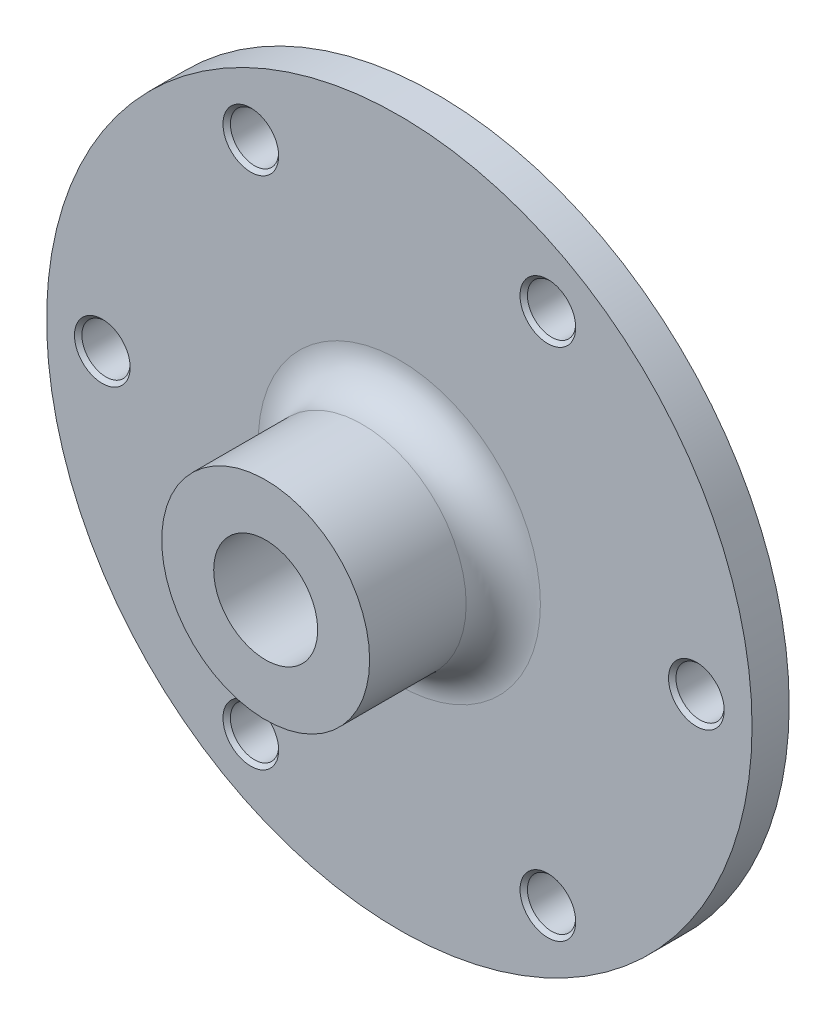
ISO-10303-21;
HEADER;
FILE_DESCRIPTION(('STEP AP214'),'2;1');
FILE_NAME('part.step','',(''),(''),'','','');
FILE_SCHEMA(('AUTOMOTIVE_DESIGN { 1 0 10303 214 1 1 1 1 }'));
ENDSEC;
DATA;
#1=APPLICATION_CONTEXT('core data for automotive mechanical design processes');
#2=APPLICATION_PROTOCOL_DEFINITION('international standard','automotive_design',2000,#1);
#3=PRODUCT_CONTEXT('',#1,'mechanical');
#4=PRODUCT('Part','Part','',(#3));
#5=PRODUCT_RELATED_PRODUCT_CATEGORY('part','',(#4));
#6=PRODUCT_DEFINITION_FORMATION('','',#4);
#7=PRODUCT_DEFINITION_CONTEXT('part definition',#1,'design');
#8=PRODUCT_DEFINITION('design','',#6,#7);
#9=PRODUCT_DEFINITION_SHAPE('','',#8);
#10=(LENGTH_UNIT() NAMED_UNIT(*) SI_UNIT(.MILLI.,.METRE.));
#11=(NAMED_UNIT(*) PLANE_ANGLE_UNIT() SI_UNIT($,.RADIAN.));
#12=(NAMED_UNIT(*) SI_UNIT($,.STERADIAN.) SOLID_ANGLE_UNIT());
#13=UNCERTAINTY_MEASURE_WITH_UNIT(LENGTH_MEASURE(1.E-05),#10,'distance_accuracy_value','');
#14=(GEOMETRIC_REPRESENTATION_CONTEXT(3) GLOBAL_UNCERTAINTY_ASSIGNED_CONTEXT((#13)) GLOBAL_UNIT_ASSIGNED_CONTEXT((#10,
#11,#12)) REPRESENTATION_CONTEXT('',''));
#15=CARTESIAN_POINT('',(0.,0.,0.));
#16=DIRECTION('',(0.,0.,1.));
#17=DIRECTION('',(1.,0.,0.));
#18=AXIS2_PLACEMENT_3D('',#15,#16,#17);
#19=CARTESIAN_POINT('',(0.,0.,2.5));
#20=DIRECTION('',(0.,0.,-1.));
#21=DIRECTION('',(-1.,0.,0.));
#22=AXIS2_PLACEMENT_3D('',#19,#20,#21);
#23=CYLINDRICAL_SURFACE('',#22,47.5);
#24=CARTESIAN_POINT('',(0.,0.,2.5));
#25=DIRECTION('',(0.,0.,1.));
#26=DIRECTION('',(1.,0.,0.));
#27=AXIS2_PLACEMENT_3D('',#24,#25,#26);
#28=CIRCLE('',#27,47.5);
#29=CARTESIAN_POINT('',(47.5,0.,2.5));
#30=VERTEX_POINT('',#29);
#31=EDGE_CURVE('E147',#30,#30,#28,.T.);
#32=ORIENTED_EDGE('',*,*,#31,.F.);
#33=EDGE_LOOP('',(#32));
#34=FACE_BOUND('',#33,.T.);
#35=CARTESIAN_POINT('',(0.,0.,-2.5));
#36=DIRECTION('',(0.,0.,1.));
#37=DIRECTION('',(1.,0.,0.));
#38=AXIS2_PLACEMENT_3D('',#35,#36,#37);
#39=CIRCLE('',#38,47.5);
#40=CARTESIAN_POINT('',(47.5,0.,-2.5));
#41=VERTEX_POINT('',#40);
#42=EDGE_CURVE('E143',#41,#41,#39,.T.);
#43=ORIENTED_EDGE('',*,*,#42,.T.);
#44=EDGE_LOOP('',(#43));
#45=FACE_BOUND('',#44,.T.);
#46=ADVANCED_FACE('F40',(#34,#45),#23,.T.);
#47=CARTESIAN_POINT('',(0.,0.,2.5));
#48=DIRECTION('',(0.,0.,1.));
#49=DIRECTION('',(1.,0.,0.));
#50=AXIS2_PLACEMENT_3D('',#47,#48,#49);
#51=PLANE('',#50);
#52=CARTESIAN_POINT('',(-20.0000000000004,34.6410161513773,2.5));
#53=DIRECTION('',(0.,0.,1.));
#54=DIRECTION('',(1.,0.,0.));
#55=AXIS2_PLACEMENT_3D('',#52,#53,#54);
#56=CIRCLE('',#55,3.75);
#57=CARTESIAN_POINT('',(-16.2500000000004,34.6410161513773,2.5));
#58=VERTEX_POINT('',#57);
#59=EDGE_CURVE('E445',#58,#58,#56,.T.);
#60=ORIENTED_EDGE('',*,*,#59,.F.);
#61=EDGE_LOOP('',(#60));
#62=FACE_BOUND('',#61,.T.);
#63=CARTESIAN_POINT('',(19.9999999999997,34.6410161513777,2.5));
#64=DIRECTION('',(0.,0.,1.));
#65=DIRECTION('',(1.,0.,0.));
#66=AXIS2_PLACEMENT_3D('',#63,#64,#65);
#67=CIRCLE('',#66,3.75);
#68=CARTESIAN_POINT('',(23.7499999999997,34.6410161513777,2.5));
#69=VERTEX_POINT('',#68);
#70=EDGE_CURVE('E94',#69,#69,#67,.T.);
#71=ORIENTED_EDGE('',*,*,#70,.F.);
#72=EDGE_LOOP('',(#71));
#73=FACE_BOUND('',#72,.T.);
#74=CARTESIAN_POINT('',(40.,0.,2.5));
#75=DIRECTION('',(0.,0.,1.));
#76=DIRECTION('',(1.,0.,0.));
#77=AXIS2_PLACEMENT_3D('',#74,#75,#76);
#78=CIRCLE('',#77,3.75);
#79=CARTESIAN_POINT('',(43.75,0.,2.5));
#80=VERTEX_POINT('',#79);
#81=EDGE_CURVE('E85',#80,#80,#78,.T.);
#82=ORIENTED_EDGE('',*,*,#81,.F.);
#83=EDGE_LOOP('',(#82));
#84=FACE_BOUND('',#83,.T.);
#85=CARTESIAN_POINT('',(20.0000000000002,-34.6410161513775,2.5));
#86=DIRECTION('',(0.,0.,1.));
#87=DIRECTION('',(1.,0.,0.));
#88=AXIS2_PLACEMENT_3D('',#85,#86,#87);
#89=CIRCLE('',#88,3.75);
#90=CARTESIAN_POINT('',(23.7500000000002,-34.6410161513775,2.5));
#91=VERTEX_POINT('',#90);
#92=EDGE_CURVE('E80',#91,#91,#89,.T.);
#93=ORIENTED_EDGE('',*,*,#92,.F.);
#94=EDGE_LOOP('',(#93));
#95=FACE_BOUND('',#94,.T.);
#96=CARTESIAN_POINT('',(-19.9999999999999,-34.6410161513776,2.5));
#97=DIRECTION('',(0.,0.,1.));
#98=DIRECTION('',(1.,0.,0.));
#99=AXIS2_PLACEMENT_3D('',#96,#97,#98);
#100=CIRCLE('',#99,3.75);
#101=CARTESIAN_POINT('',(-16.2499999999999,-34.6410161513776,2.5));
#102=VERTEX_POINT('',#101);
#103=EDGE_CURVE('E75',#102,#102,#100,.T.);
#104=ORIENTED_EDGE('',*,*,#103,.F.);
#105=EDGE_LOOP('',(#104));
#106=FACE_BOUND('',#105,.T.);
#107=CARTESIAN_POINT('',(-40.,0.,2.5));
#108=DIRECTION('',(0.,0.,1.));
#109=DIRECTION('',(1.,0.,0.));
#110=AXIS2_PLACEMENT_3D('',#107,#108,#109);
#111=CIRCLE('',#110,3.75);
#112=CARTESIAN_POINT('',(-36.25,0.,2.5));
#113=VERTEX_POINT('',#112);
#114=EDGE_CURVE('E69',#113,#113,#111,.T.);
#115=ORIENTED_EDGE('',*,*,#114,.F.);
#116=EDGE_LOOP('',(#115));
#117=FACE_BOUND('',#116,.T.);
#118=CARTESIAN_POINT('',(0.,0.,2.5));
#119=DIRECTION('',(0.,0.,1.));
#120=DIRECTION('',(1.,0.,0.));
#121=AXIS2_PLACEMENT_3D('',#118,#119,#120);
#122=CIRCLE('',#121,19.);
#123=CARTESIAN_POINT('',(19.,0.,2.5));
#124=VERTEX_POINT('',#123);
#125=EDGE_CURVE('E10',#124,#124,#122,.F.);
#126=ORIENTED_EDGE('',*,*,#125,.T.);
#127=EDGE_LOOP('',(#126));
#128=FACE_BOUND('',#127,.T.);
#129=ORIENTED_EDGE('',*,*,#31,.T.);
#130=EDGE_LOOP('',(#129));
#131=FACE_BOUND('',#130,.T.);
#132=ADVANCED_FACE('F158',(#62,#73,#84,#95,#106,#117,#128,#131),#51,.T.);
#133=CARTESIAN_POINT('',(0.,0.,-2.5));
#134=DIRECTION('',(0.,0.,1.));
#135=DIRECTION('',(1.,0.,0.));
#136=AXIS2_PLACEMENT_3D('',#133,#134,#135);
#137=PLANE('',#136);
#138=CARTESIAN_POINT('',(-20.0000000000004,34.6410161513773,-2.5));
#139=DIRECTION('',(0.,0.,1.));
#140=DIRECTION('',(1.,0.,0.));
#141=AXIS2_PLACEMENT_3D('',#138,#139,#140);
#142=CIRCLE('',#141,3.25);
#143=CARTESIAN_POINT('',(-16.7500000000004,34.6410161513773,-2.5));
#144=VERTEX_POINT('',#143);
#145=EDGE_CURVE('E44',#144,#144,#142,.T.);
#146=ORIENTED_EDGE('',*,*,#145,.T.);
#147=EDGE_LOOP('',(#146));
#148=FACE_BOUND('',#147,.T.);
#149=CARTESIAN_POINT('',(19.9999999999997,34.6410161513777,-2.5));
#150=DIRECTION('',(0.,0.,1.));
#151=DIRECTION('',(1.,0.,0.));
#152=AXIS2_PLACEMENT_3D('',#149,#150,#151);
#153=CIRCLE('',#152,3.25);
#154=CARTESIAN_POINT('',(23.2499999999997,34.6410161513777,-2.5));
#155=VERTEX_POINT('',#154);
#156=EDGE_CURVE('E82',#155,#155,#153,.T.);
#157=ORIENTED_EDGE('',*,*,#156,.T.);
#158=EDGE_LOOP('',(#157));
#159=FACE_BOUND('',#158,.T.);
#160=CARTESIAN_POINT('',(40.,0.,-2.5));
#161=DIRECTION('',(0.,0.,1.));
#162=DIRECTION('',(1.,0.,0.));
#163=AXIS2_PLACEMENT_3D('',#160,#161,#162);
#164=CIRCLE('',#163,3.25);
#165=CARTESIAN_POINT('',(43.25,0.,-2.5));
#166=VERTEX_POINT('',#165);
#167=EDGE_CURVE('E77',#166,#166,#164,.T.);
#168=ORIENTED_EDGE('',*,*,#167,.T.);
#169=EDGE_LOOP('',(#168));
#170=FACE_BOUND('',#169,.T.);
#171=CARTESIAN_POINT('',(20.0000000000002,-34.6410161513775,-2.5));
#172=DIRECTION('',(0.,0.,1.));
#173=DIRECTION('',(1.,0.,0.));
#174=AXIS2_PLACEMENT_3D('',#171,#172,#173);
#175=CIRCLE('',#174,3.25);
#176=CARTESIAN_POINT('',(23.2500000000002,-34.6410161513775,-2.5));
#177=VERTEX_POINT('',#176);
#178=EDGE_CURVE('E71',#177,#177,#175,.T.);
#179=ORIENTED_EDGE('',*,*,#178,.T.);
#180=EDGE_LOOP('',(#179));
#181=FACE_BOUND('',#180,.T.);
#182=CARTESIAN_POINT('',(-19.9999999999999,-34.6410161513776,-2.5));
#183=DIRECTION('',(0.,0.,1.));
#184=DIRECTION('',(1.,0.,0.));
#185=AXIS2_PLACEMENT_3D('',#182,#183,#184);
#186=CIRCLE('',#185,3.25);
#187=CARTESIAN_POINT('',(-16.7499999999999,-34.6410161513776,-2.5));
#188=VERTEX_POINT('',#187);
#189=EDGE_CURVE('E65',#188,#188,#186,.T.);
#190=ORIENTED_EDGE('',*,*,#189,.T.);
#191=EDGE_LOOP('',(#190));
#192=FACE_BOUND('',#191,.T.);
#193=CARTESIAN_POINT('',(-40.,0.,-2.5));
#194=DIRECTION('',(0.,0.,1.));
#195=DIRECTION('',(1.,0.,0.));
#196=AXIS2_PLACEMENT_3D('',#193,#194,#195);
#197=CIRCLE('',#196,3.25);
#198=CARTESIAN_POINT('',(-36.75,0.,-2.5));
#199=VERTEX_POINT('',#198);
#200=EDGE_CURVE('E59',#199,#199,#197,.T.);
#201=ORIENTED_EDGE('',*,*,#200,.T.);
#202=EDGE_LOOP('',(#201));
#203=FACE_BOUND('',#202,.T.);
#204=CARTESIAN_POINT('',(0.,0.,-2.5));
#205=DIRECTION('',(0.,0.,-1.));
#206=DIRECTION('',(-1.,0.,0.));
#207=AXIS2_PLACEMENT_3D('',#204,#205,#206);
#208=CIRCLE('',#207,35.);
#209=CARTESIAN_POINT('',(-35.,0.,-2.5));
#210=VERTEX_POINT('',#209);
#211=EDGE_CURVE('E55',#210,#210,#208,.T.);
#212=ORIENTED_EDGE('',*,*,#211,.F.);
#213=EDGE_LOOP('',(#212));
#214=FACE_BOUND('',#213,.T.);
#215=ORIENTED_EDGE('',*,*,#42,.F.);
#216=EDGE_LOOP('',(#215));
#217=FACE_BOUND('',#216,.T.);
#218=ADVANCED_FACE('F155',(#148,#159,#170,#181,#192,#203,#214,#217),#137,.F.);
#219=CARTESIAN_POINT('',(0.,0.,-7.5));
#220=DIRECTION('',(0.,0.,1.));
#221=DIRECTION('',(1.,0.,0.));
#222=AXIS2_PLACEMENT_3D('',#219,#220,#221);
#223=CYLINDRICAL_SURFACE('',#222,35.);
#224=CARTESIAN_POINT('',(0.,0.,-7.5));
#225=DIRECTION('',(0.,0.,-1.));
#226=DIRECTION('',(-1.,0.,0.));
#227=AXIS2_PLACEMENT_3D('',#224,#225,#226);
#228=CIRCLE('',#227,35.);
#229=CARTESIAN_POINT('',(-35.,0.,-7.5));
#230=VERTEX_POINT('',#229);
#231=EDGE_CURVE('E139',#230,#230,#228,.T.);
#232=ORIENTED_EDGE('',*,*,#231,.F.);
#233=EDGE_LOOP('',(#232));
#234=FACE_BOUND('',#233,.T.);
#235=ORIENTED_EDGE('',*,*,#211,.T.);
#236=EDGE_LOOP('',(#235));
#237=FACE_BOUND('',#236,.T.);
#238=ADVANCED_FACE('F157',(#234,#237),#223,.T.);
#239=CARTESIAN_POINT('',(0.,0.,-7.5));
#240=DIRECTION('',(0.,0.,-1.));
#241=DIRECTION('',(-1.,0.,0.));
#242=AXIS2_PLACEMENT_3D('',#239,#240,#241);
#243=PLANE('',#242);
#244=CARTESIAN_POINT('',(0.,0.,-7.5));
#245=DIRECTION('',(0.,0.,-1.));
#246=DIRECTION('',(-1.,0.,0.));
#247=AXIS2_PLACEMENT_3D('',#244,#245,#246);
#248=CIRCLE('',#247,13.);
#249=CARTESIAN_POINT('',(-13.,0.,-7.5));
#250=VERTEX_POINT('',#249);
#251=EDGE_CURVE('E63',#250,#250,#248,.T.);
#252=ORIENTED_EDGE('',*,*,#251,.F.);
#253=EDGE_LOOP('',(#252));
#254=FACE_BOUND('',#253,.T.);
#255=ORIENTED_EDGE('',*,*,#231,.T.);
#256=EDGE_LOOP('',(#255));
#257=FACE_BOUND('',#256,.T.);
#258=ADVANCED_FACE('F165',(#254,#257),#243,.T.);
#259=CARTESIAN_POINT('',(0.,0.,20.5));
#260=DIRECTION('',(0.,0.,-1.));
#261=DIRECTION('',(-1.,0.,0.));
#262=AXIS2_PLACEMENT_3D('',#259,#260,#261);
#263=CYLINDRICAL_SURFACE('',#262,14.);
#264=CARTESIAN_POINT('',(0.,0.,7.5));
#265=DIRECTION('',(0.,0.,1.));
#266=DIRECTION('',(1.,0.,0.));
#267=AXIS2_PLACEMENT_3D('',#264,#265,#266);
#268=CIRCLE('',#267,14.);
#269=CARTESIAN_POINT('',(14.,0.,7.5));
#270=VERTEX_POINT('',#269);
#271=EDGE_CURVE('E49',#270,#270,#268,.T.);
#272=ORIENTED_EDGE('',*,*,#271,.T.);
#273=EDGE_LOOP('',(#272));
#274=FACE_BOUND('',#273,.T.);
#275=CARTESIAN_POINT('',(0.,0.,20.5));
#276=DIRECTION('',(0.,0.,1.));
#277=DIRECTION('',(1.,0.,0.));
#278=AXIS2_PLACEMENT_3D('',#275,#276,#277);
#279=CIRCLE('',#278,14.);
#280=CARTESIAN_POINT('',(14.,0.,20.5));
#281=VERTEX_POINT('',#280);
#282=EDGE_CURVE('E135',#281,#281,#279,.T.);
#283=ORIENTED_EDGE('',*,*,#282,.F.);
#284=EDGE_LOOP('',(#283));
#285=FACE_BOUND('',#284,.T.);
#286=ADVANCED_FACE('F367',(#274,#285),#263,.T.);
#287=CARTESIAN_POINT('',(0.,0.,20.5));
#288=DIRECTION('',(0.,0.,1.));
#289=DIRECTION('',(1.,0.,0.));
#290=AXIS2_PLACEMENT_3D('',#287,#288,#289);
#291=PLANE('',#290);
#292=CARTESIAN_POINT('',(0.,0.,20.5));
#293=DIRECTION('',(0.,0.,-1.));
#294=DIRECTION('',(-1.,0.,0.));
#295=AXIS2_PLACEMENT_3D('',#292,#293,#294);
#296=CIRCLE('',#295,6.99999999999999);
#297=CARTESIAN_POINT('',(-6.99999999999999,0.,20.5));
#298=VERTEX_POINT('',#297);
#299=EDGE_CURVE('E131',#298,#298,#296,.T.);
#300=ORIENTED_EDGE('',*,*,#299,.T.);
#301=EDGE_LOOP('',(#300));
#302=FACE_BOUND('',#301,.T.);
#303=ORIENTED_EDGE('',*,*,#282,.T.);
#304=EDGE_LOOP('',(#303));
#305=FACE_BOUND('',#304,.T.);
#306=ADVANCED_FACE('F357',(#302,#305),#291,.T.);
#307=CARTESIAN_POINT('',(0.,0.,-7.5));
#308=DIRECTION('',(0.,0.,-1.));
#309=DIRECTION('',(-1.,0.,0.));
#310=AXIS2_PLACEMENT_3D('',#307,#308,#309);
#311=CYLINDRICAL_SURFACE('',#310,6.99999999999999);
#312=ORIENTED_EDGE('',*,*,#299,.F.);
#313=EDGE_LOOP('',(#312));
#314=FACE_BOUND('',#313,.T.);
#315=CARTESIAN_POINT('',(0.,0.,-1.5));
#316=DIRECTION('',(0.,0.,-1.));
#317=DIRECTION('',(-1.,0.,0.));
#318=AXIS2_PLACEMENT_3D('',#315,#316,#317);
#319=CIRCLE('',#318,7.);
#320=CARTESIAN_POINT('',(-7.,0.,-1.5));
#321=VERTEX_POINT('',#320);
#322=EDGE_CURVE('E127',#321,#321,#319,.T.);
#323=ORIENTED_EDGE('',*,*,#322,.T.);
#324=EDGE_LOOP('',(#323));
#325=FACE_BOUND('',#324,.T.);
#326=ADVANCED_FACE('F347',(#314,#325),#311,.F.);
#327=CARTESIAN_POINT('',(0.,0.,-7.5));
#328=DIRECTION('',(0.,0.,-1.));
#329=DIRECTION('',(-1.,0.,0.));
#330=AXIS2_PLACEMENT_3D('',#327,#328,#329);
#331=CONICAL_SURFACE('',#330,13.,0.785398163397449);
#332=ORIENTED_EDGE('',*,*,#322,.F.);
#333=EDGE_LOOP('',(#332));
#334=FACE_BOUND('',#333,.T.);
#335=ORIENTED_EDGE('',*,*,#251,.T.);
#336=EDGE_LOOP('',(#335));
#337=FACE_BOUND('',#336,.T.);
#338=ADVANCED_FACE('F338',(#334,#337),#331,.F.);
#339=CARTESIAN_POINT('',(0.,0.,7.5));
#340=DIRECTION('',(0.,0.,1.));
#341=DIRECTION('',(1.,0.,0.));
#342=AXIS2_PLACEMENT_3D('',#339,#340,#341);
#343=TOROIDAL_SURFACE('',#342,19.,5.);
#344=ORIENTED_EDGE('',*,*,#125,.F.);
#345=EDGE_LOOP('',(#344));
#346=FACE_BOUND('',#345,.T.);
#347=ORIENTED_EDGE('',*,*,#271,.F.);
#348=EDGE_LOOP('',(#347));
#349=FACE_BOUND('',#348,.T.);
#350=ADVANCED_FACE('F42',(#346,#349),#343,.F.);
#351=CARTESIAN_POINT('',(-40.,0.,2.5));
#352=DIRECTION('',(0.,0.,1.));
#353=DIRECTION('',(1.,0.,0.));
#354=AXIS2_PLACEMENT_3D('',#351,#352,#353);
#355=CYLINDRICAL_SURFACE('',#354,3.25);
#356=CARTESIAN_POINT('',(-40.,0.,1.99999999999999));
#357=DIRECTION('',(0.,0.,1.));
#358=DIRECTION('',(1.,0.,0.));
#359=AXIS2_PLACEMENT_3D('',#356,#357,#358);
#360=CIRCLE('',#359,3.25);
#361=CARTESIAN_POINT('',(-36.75,0.,1.99999999999999));
#362=VERTEX_POINT('',#361);
#363=EDGE_CURVE('E64',#362,#362,#360,.T.);
#364=ORIENTED_EDGE('',*,*,#363,.T.);
#365=EDGE_LOOP('',(#364));
#366=FACE_BOUND('',#365,.T.);
#367=ORIENTED_EDGE('',*,*,#200,.F.);
#368=EDGE_LOOP('',(#367));
#369=FACE_BOUND('',#368,.T.);
#370=ADVANCED_FACE('F321',(#366,#369),#355,.F.);
#371=CARTESIAN_POINT('',(-40.,0.,2.5));
#372=DIRECTION('',(0.,0.,1.));
#373=DIRECTION('',(1.,0.,0.));
#374=AXIS2_PLACEMENT_3D('',#371,#372,#373);
#375=CONICAL_SURFACE('',#374,3.75,0.785398163397441);
#376=ORIENTED_EDGE('',*,*,#363,.F.);
#377=EDGE_LOOP('',(#376));
#378=FACE_BOUND('',#377,.T.);
#379=ORIENTED_EDGE('',*,*,#114,.T.);
#380=EDGE_LOOP('',(#379));
#381=FACE_BOUND('',#380,.T.);
#382=ADVANCED_FACE('F189',(#378,#381),#375,.F.);
#383=CARTESIAN_POINT('',(-19.9999999999999,-34.6410161513776,2.5));
#384=DIRECTION('',(0.,0.,1.));
#385=DIRECTION('',(1.,0.,0.));
#386=AXIS2_PLACEMENT_3D('',#383,#384,#385);
#387=CYLINDRICAL_SURFACE('',#386,3.25);
#388=CARTESIAN_POINT('',(-19.9999999999999,-34.6410161513776,1.99999999999999));
#389=DIRECTION('',(0.,0.,1.));
#390=DIRECTION('',(1.,0.,0.));
#391=AXIS2_PLACEMENT_3D('',#388,#389,#390);
#392=CIRCLE('',#391,3.25);
#393=CARTESIAN_POINT('',(-16.7499999999999,-34.6410161513776,1.99999999999999));
#394=VERTEX_POINT('',#393);
#395=EDGE_CURVE('E70',#394,#394,#392,.T.);
#396=ORIENTED_EDGE('',*,*,#395,.T.);
#397=EDGE_LOOP('',(#396));
#398=FACE_BOUND('',#397,.T.);
#399=ORIENTED_EDGE('',*,*,#189,.F.);
#400=EDGE_LOOP('',(#399));
#401=FACE_BOUND('',#400,.T.);
#402=ADVANCED_FACE('F200',(#398,#401),#387,.F.);
#403=CARTESIAN_POINT('',(-19.9999999999999,-34.6410161513776,2.5));
#404=DIRECTION('',(0.,0.,1.));
#405=DIRECTION('',(1.,0.,0.));
#406=AXIS2_PLACEMENT_3D('',#403,#404,#405);
#407=CONICAL_SURFACE('',#406,3.75,0.785398163397444);
#408=ORIENTED_EDGE('',*,*,#395,.F.);
#409=EDGE_LOOP('',(#408));
#410=FACE_BOUND('',#409,.T.);
#411=ORIENTED_EDGE('',*,*,#103,.T.);
#412=EDGE_LOOP('',(#411));
#413=FACE_BOUND('',#412,.T.);
#414=ADVANCED_FACE('F205',(#410,#413),#407,.F.);
#415=CARTESIAN_POINT('',(20.0000000000002,-34.6410161513775,2.5));
#416=DIRECTION('',(0.,0.,1.));
#417=DIRECTION('',(1.,0.,0.));
#418=AXIS2_PLACEMENT_3D('',#415,#416,#417);
#419=CYLINDRICAL_SURFACE('',#418,3.25);
#420=CARTESIAN_POINT('',(20.0000000000002,-34.6410161513775,1.99999999999999));
#421=DIRECTION('',(0.,0.,1.));
#422=DIRECTION('',(1.,0.,0.));
#423=AXIS2_PLACEMENT_3D('',#420,#421,#422);
#424=CIRCLE('',#423,3.25);
#425=CARTESIAN_POINT('',(23.2500000000002,-34.6410161513775,1.99999999999999));
#426=VERTEX_POINT('',#425);
#427=EDGE_CURVE('E76',#426,#426,#424,.T.);
#428=ORIENTED_EDGE('',*,*,#427,.T.);
#429=EDGE_LOOP('',(#428));
#430=FACE_BOUND('',#429,.T.);
#431=ORIENTED_EDGE('',*,*,#178,.F.);
#432=EDGE_LOOP('',(#431));
#433=FACE_BOUND('',#432,.T.);
#434=ADVANCED_FACE('F216',(#430,#433),#419,.F.);
#435=CARTESIAN_POINT('',(20.0000000000002,-34.6410161513775,2.5));
#436=DIRECTION('',(0.,0.,1.));
#437=DIRECTION('',(1.,0.,0.));
#438=AXIS2_PLACEMENT_3D('',#435,#436,#437);
#439=CONICAL_SURFACE('',#438,3.75,0.785398163397444);
#440=ORIENTED_EDGE('',*,*,#427,.F.);
#441=EDGE_LOOP('',(#440));
#442=FACE_BOUND('',#441,.T.);
#443=ORIENTED_EDGE('',*,*,#92,.T.);
#444=EDGE_LOOP('',(#443));
#445=FACE_BOUND('',#444,.T.);
#446=ADVANCED_FACE('F227',(#442,#445),#439,.F.);
#447=CARTESIAN_POINT('',(40.,0.,2.5));
#448=DIRECTION('',(0.,0.,1.));
#449=DIRECTION('',(1.,0.,0.));
#450=AXIS2_PLACEMENT_3D('',#447,#448,#449);
#451=CYLINDRICAL_SURFACE('',#450,3.25);
#452=CARTESIAN_POINT('',(40.,0.,1.99999999999999));
#453=DIRECTION('',(0.,0.,1.));
#454=DIRECTION('',(1.,0.,0.));
#455=AXIS2_PLACEMENT_3D('',#452,#453,#454);
#456=CIRCLE('',#455,3.25);
#457=CARTESIAN_POINT('',(43.25,0.,1.99999999999999));
#458=VERTEX_POINT('',#457);
#459=EDGE_CURVE('E81',#458,#458,#456,.T.);
#460=ORIENTED_EDGE('',*,*,#459,.T.);
#461=EDGE_LOOP('',(#460));
#462=FACE_BOUND('',#461,.T.);
#463=ORIENTED_EDGE('',*,*,#167,.F.);
#464=EDGE_LOOP('',(#463));
#465=FACE_BOUND('',#464,.T.);
#466=ADVANCED_FACE('F238',(#462,#465),#451,.F.);
#467=CARTESIAN_POINT('',(40.,0.,2.5));
#468=DIRECTION('',(0.,0.,1.));
#469=DIRECTION('',(1.,0.,0.));
#470=AXIS2_PLACEMENT_3D('',#467,#468,#469);
#471=CONICAL_SURFACE('',#470,3.75,0.785398163397441);
#472=ORIENTED_EDGE('',*,*,#459,.F.);
#473=EDGE_LOOP('',(#472));
#474=FACE_BOUND('',#473,.T.);
#475=ORIENTED_EDGE('',*,*,#81,.T.);
#476=EDGE_LOOP('',(#475));
#477=FACE_BOUND('',#476,.T.);
#478=ADVANCED_FACE('F249',(#474,#477),#471,.F.);
#479=CARTESIAN_POINT('',(19.9999999999997,34.6410161513777,2.5));
#480=DIRECTION('',(0.,0.,1.));
#481=DIRECTION('',(1.,0.,0.));
#482=AXIS2_PLACEMENT_3D('',#479,#480,#481);
#483=CYLINDRICAL_SURFACE('',#482,3.25);
#484=CARTESIAN_POINT('',(19.9999999999997,34.6410161513777,1.99999999999999));
#485=DIRECTION('',(0.,0.,1.));
#486=DIRECTION('',(1.,0.,0.));
#487=AXIS2_PLACEMENT_3D('',#484,#485,#486);
#488=CIRCLE('',#487,3.25);
#489=CARTESIAN_POINT('',(23.2499999999997,34.6410161513777,1.99999999999999));
#490=VERTEX_POINT('',#489);
#491=EDGE_CURVE('E86',#490,#490,#488,.T.);
#492=ORIENTED_EDGE('',*,*,#491,.T.);
#493=EDGE_LOOP('',(#492));
#494=FACE_BOUND('',#493,.T.);
#495=ORIENTED_EDGE('',*,*,#156,.F.);
#496=EDGE_LOOP('',(#495));
#497=FACE_BOUND('',#496,.T.);
#498=ADVANCED_FACE('F260',(#494,#497),#483,.F.);
#499=CARTESIAN_POINT('',(19.9999999999997,34.6410161513777,2.5));
#500=DIRECTION('',(0.,0.,1.));
#501=DIRECTION('',(1.,0.,0.));
#502=AXIS2_PLACEMENT_3D('',#499,#500,#501);
#503=CONICAL_SURFACE('',#502,3.75,0.785398163397444);
#504=ORIENTED_EDGE('',*,*,#491,.F.);
#505=EDGE_LOOP('',(#504));
#506=FACE_BOUND('',#505,.T.);
#507=ORIENTED_EDGE('',*,*,#70,.T.);
#508=EDGE_LOOP('',(#507));
#509=FACE_BOUND('',#508,.T.);
#510=ADVANCED_FACE('F271',(#506,#509),#503,.F.);
#511=CARTESIAN_POINT('',(-20.0000000000004,34.6410161513773,2.5));
#512=DIRECTION('',(0.,0.,1.));
#513=DIRECTION('',(1.,0.,0.));
#514=AXIS2_PLACEMENT_3D('',#511,#512,#513);
#515=CYLINDRICAL_SURFACE('',#514,3.25);
#516=CARTESIAN_POINT('',(-20.0000000000004,34.6410161513773,1.99999999999999));
#517=DIRECTION('',(0.,0.,1.));
#518=DIRECTION('',(1.,0.,0.));
#519=AXIS2_PLACEMENT_3D('',#516,#517,#518);
#520=CIRCLE('',#519,3.25);
#521=CARTESIAN_POINT('',(-16.7500000000004,34.6410161513773,1.99999999999999));
#522=VERTEX_POINT('',#521);
#523=EDGE_CURVE('E442',#522,#522,#520,.T.);
#524=ORIENTED_EDGE('',*,*,#523,.T.);
#525=EDGE_LOOP('',(#524));
#526=FACE_BOUND('',#525,.T.);
#527=ORIENTED_EDGE('',*,*,#145,.F.);
#528=EDGE_LOOP('',(#527));
#529=FACE_BOUND('',#528,.T.);
#530=ADVANCED_FACE('F281',(#526,#529),#515,.F.);
#531=CARTESIAN_POINT('',(-20.0000000000004,34.6410161513773,2.5));
#532=DIRECTION('',(0.,0.,1.));
#533=DIRECTION('',(1.,0.,0.));
#534=AXIS2_PLACEMENT_3D('',#531,#532,#533);
#535=CONICAL_SURFACE('',#534,3.75,0.785398163397444);
#536=ORIENTED_EDGE('',*,*,#523,.F.);
#537=EDGE_LOOP('',(#536));
#538=FACE_BOUND('',#537,.T.);
#539=ORIENTED_EDGE('',*,*,#59,.T.);
#540=EDGE_LOOP('',(#539));
#541=FACE_BOUND('',#540,.T.);
#542=ADVANCED_FACE('F292',(#538,#541),#535,.F.);
#543=CLOSED_SHELL('',(#46,#132,#218,#238,#258,#286,#306,#326,#338,#350,#370,#382,#402,#414,#434,
#446,#466,#478,#498,#510,#530,#542));
#544=MANIFOLD_SOLID_BREP('B2',#543);
#545=ADVANCED_BREP_SHAPE_REPRESENTATION('',(#18,#544),#14);
#546=SHAPE_DEFINITION_REPRESENTATION(#9,#545);
ENDSEC;
END-ISO-10303-21;
